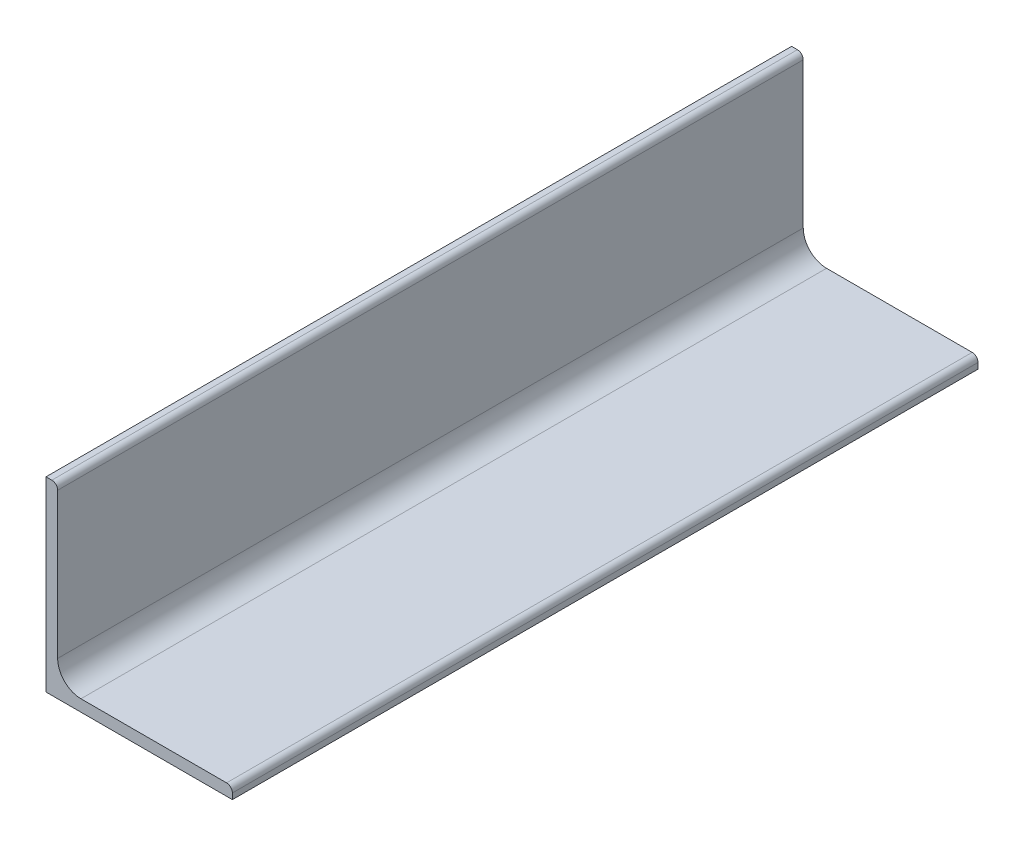
ISO-10303-21;
HEADER;
FILE_DESCRIPTION(('STEP AP214'),'2;1');
FILE_NAME('part.step','',(''),(''),'','','');
FILE_SCHEMA(('AUTOMOTIVE_DESIGN { 1 0 10303 214 1 1 1 1 }'));
ENDSEC;
DATA;
#1=APPLICATION_CONTEXT('core data for automotive mechanical design processes');
#2=APPLICATION_PROTOCOL_DEFINITION('international standard','automotive_design',2000,#1);
#3=PRODUCT_CONTEXT('',#1,'mechanical');
#4=PRODUCT('Part','Part','',(#3));
#5=PRODUCT_RELATED_PRODUCT_CATEGORY('part','',(#4));
#6=PRODUCT_DEFINITION_FORMATION('','',#4);
#7=PRODUCT_DEFINITION_CONTEXT('part definition',#1,'design');
#8=PRODUCT_DEFINITION('design','',#6,#7);
#9=PRODUCT_DEFINITION_SHAPE('','',#8);
#10=(LENGTH_UNIT() NAMED_UNIT(*) SI_UNIT(.MILLI.,.METRE.));
#11=(NAMED_UNIT(*) PLANE_ANGLE_UNIT() SI_UNIT($,.RADIAN.));
#12=(NAMED_UNIT(*) SI_UNIT($,.STERADIAN.) SOLID_ANGLE_UNIT());
#13=UNCERTAINTY_MEASURE_WITH_UNIT(LENGTH_MEASURE(1.E-05),#10,'distance_accuracy_value','');
#14=(GEOMETRIC_REPRESENTATION_CONTEXT(3) GLOBAL_UNCERTAINTY_ASSIGNED_CONTEXT((#13)) GLOBAL_UNIT_ASSIGNED_CONTEXT((#10,
#11,#12)) REPRESENTATION_CONTEXT('',''));
#15=CARTESIAN_POINT('',(0.,0.,0.));
#16=DIRECTION('',(0.,0.,1.));
#17=DIRECTION('',(1.,0.,0.));
#18=AXIS2_PLACEMENT_3D('',#15,#16,#17);
#19=CARTESIAN_POINT('',(0.490776827053332,76.2882459217981,304.8));
#20=DIRECTION('',(1.,0.,0.));
#21=DIRECTION('',(0.,0.,-1.));
#22=AXIS2_PLACEMENT_3D('',#19,#20,#21);
#23=PLANE('',#22);
#24=DIRECTION('',(0.,-1.,0.));
#25=VECTOR('',#24,1.);
#26=CARTESIAN_POINT('',(0.490776827053332,76.2882459217981,0.));
#27=LINE('',#26,#25);
#28=CARTESIAN_POINT('',(0.490776827053332,76.2882459217981,0.));
#29=VERTEX_POINT('',#28);
#30=CARTESIAN_POINT('',(0.490776827053332,0.0882459217980795,0.));
#31=VERTEX_POINT('',#30);
#32=EDGE_CURVE('E135',#29,#31,#27,.T.);
#33=ORIENTED_EDGE('',*,*,#32,.T.);
#34=DIRECTION('',(0.,0.,-1.));
#35=VECTOR('',#34,1.);
#36=CARTESIAN_POINT('',(0.490776827053332,0.0882459217980795,304.8));
#37=LINE('',#36,#35);
#38=CARTESIAN_POINT('',(0.490776827053332,0.0882459217980795,304.8));
#39=VERTEX_POINT('',#38);
#40=EDGE_CURVE('E11',#39,#31,#37,.T.);
#41=ORIENTED_EDGE('',*,*,#40,.F.);
#42=DIRECTION('',(0.,-1.,0.));
#43=VECTOR('',#42,1.);
#44=CARTESIAN_POINT('',(0.490776827053332,76.2882459217981,304.8));
#45=LINE('',#44,#43);
#46=CARTESIAN_POINT('',(0.490776827053332,76.2882459217981,304.8));
#47=VERTEX_POINT('',#46);
#48=EDGE_CURVE('E151',#47,#39,#45,.T.);
#49=ORIENTED_EDGE('',*,*,#48,.F.);
#50=DIRECTION('',(0.,0.,-1.));
#51=VECTOR('',#50,1.);
#52=CARTESIAN_POINT('',(0.490776827053332,76.2882459217981,304.8));
#53=LINE('',#52,#51);
#54=EDGE_CURVE('E131',#47,#29,#53,.T.);
#55=ORIENTED_EDGE('',*,*,#54,.T.);
#56=EDGE_LOOP('',(#33,#41,#49,#55));
#57=FACE_BOUND('',#56,.T.);
#58=ADVANCED_FACE('F33',(#57),#23,.F.);
#59=CARTESIAN_POINT('',(0.490776827053332,0.0882459217980795,304.8));
#60=DIRECTION('',(0.,1.,0.));
#61=DIRECTION('',(0.,0.,1.));
#62=AXIS2_PLACEMENT_3D('',#59,#60,#61);
#63=PLANE('',#62);
#64=DIRECTION('',(1.,0.,0.));
#65=VECTOR('',#64,1.);
#66=CARTESIAN_POINT('',(0.490776827053332,0.0882459217980795,0.));
#67=LINE('',#66,#65);
#68=CARTESIAN_POINT('',(76.6907768270533,0.0882459217980795,0.));
#69=VERTEX_POINT('',#68);
#70=EDGE_CURVE('E138',#31,#69,#67,.T.);
#71=ORIENTED_EDGE('',*,*,#70,.T.);
#72=DIRECTION('',(0.,0.,-1.));
#73=VECTOR('',#72,1.);
#74=CARTESIAN_POINT('',(76.6907768270533,0.0882459217980795,304.8));
#75=LINE('',#74,#73);
#76=CARTESIAN_POINT('',(76.6907768270533,0.0882459217980795,304.8));
#77=VERTEX_POINT('',#76);
#78=EDGE_CURVE('E41',#77,#69,#75,.T.);
#79=ORIENTED_EDGE('',*,*,#78,.F.);
#80=DIRECTION('',(1.,0.,0.));
#81=VECTOR('',#80,1.);
#82=CARTESIAN_POINT('',(0.490776827053332,0.0882459217980795,304.8));
#83=LINE('',#82,#81);
#84=EDGE_CURVE('E95',#39,#77,#83,.T.);
#85=ORIENTED_EDGE('',*,*,#84,.F.);
#86=ORIENTED_EDGE('',*,*,#40,.T.);
#87=EDGE_LOOP('',(#71,#79,#85,#86));
#88=FACE_BOUND('',#87,.T.);
#89=ADVANCED_FACE('F194',(#88),#63,.F.);
#90=CARTESIAN_POINT('',(76.6907768270533,0.0882459217980795,304.8));
#91=DIRECTION('',(-1.,0.,0.));
#92=DIRECTION('',(0.,0.,1.));
#93=AXIS2_PLACEMENT_3D('',#90,#91,#92);
#94=PLANE('',#93);
#95=DIRECTION('',(0.,1.,0.));
#96=VECTOR('',#95,1.);
#97=CARTESIAN_POINT('',(76.6907768270533,0.0882459217980795,0.));
#98=LINE('',#97,#96);
#99=CARTESIAN_POINT('',(76.6907768270533,2.46949592179808,0.));
#100=VERTEX_POINT('',#99);
#101=EDGE_CURVE('E140',#69,#100,#98,.T.);
#102=ORIENTED_EDGE('',*,*,#101,.T.);
#103=DIRECTION('',(0.,0.,-1.));
#104=VECTOR('',#103,1.);
#105=CARTESIAN_POINT('',(76.6907768270533,2.46949592179808,304.8));
#106=LINE('',#105,#104);
#107=CARTESIAN_POINT('',(76.6907768270533,2.46949592179808,304.8));
#108=VERTEX_POINT('',#107);
#109=EDGE_CURVE('E161',#108,#100,#106,.T.);
#110=ORIENTED_EDGE('',*,*,#109,.F.);
#111=DIRECTION('',(0.,1.,0.));
#112=VECTOR('',#111,1.);
#113=CARTESIAN_POINT('',(76.6907768270533,0.0882459217980795,304.8));
#114=LINE('',#113,#112);
#115=EDGE_CURVE('E169',#77,#108,#114,.T.);
#116=ORIENTED_EDGE('',*,*,#115,.F.);
#117=ORIENTED_EDGE('',*,*,#78,.T.);
#118=EDGE_LOOP('',(#102,#110,#116,#117));
#119=FACE_BOUND('',#118,.T.);
#120=ADVANCED_FACE('F167',(#119),#94,.F.);
#121=CARTESIAN_POINT('',(74.3095268270533,2.46949592179808,304.8));
#122=DIRECTION('',(0.,0.,-1.));
#123=DIRECTION('',(-1.,0.,0.));
#124=AXIS2_PLACEMENT_3D('',#121,#122,#123);
#125=CYLINDRICAL_SURFACE('',#124,2.38125);
#126=CARTESIAN_POINT('',(74.3095268270533,2.46949592179808,0.));
#127=DIRECTION('',(0.,0.,1.));
#128=DIRECTION('',(1.,0.,0.));
#129=AXIS2_PLACEMENT_3D('',#126,#127,#128);
#130=CIRCLE('',#129,2.38125);
#131=CARTESIAN_POINT('',(74.3095268270533,4.85074592179808,0.));
#132=VERTEX_POINT('',#131);
#133=EDGE_CURVE('E142',#100,#132,#130,.T.);
#134=ORIENTED_EDGE('',*,*,#133,.T.);
#135=DIRECTION('',(0.,0.,-1.));
#136=VECTOR('',#135,1.);
#137=CARTESIAN_POINT('',(74.3095268270533,4.85074592179808,304.8));
#138=LINE('',#137,#136);
#139=CARTESIAN_POINT('',(74.3095268270533,4.85074592179808,304.8));
#140=VERTEX_POINT('',#139);
#141=EDGE_CURVE('E158',#140,#132,#138,.T.);
#142=ORIENTED_EDGE('',*,*,#141,.F.);
#143=CARTESIAN_POINT('',(74.3095268270533,2.46949592179808,304.8));
#144=DIRECTION('',(0.,0.,1.));
#145=DIRECTION('',(1.,0.,0.));
#146=AXIS2_PLACEMENT_3D('',#143,#144,#145);
#147=CIRCLE('',#146,2.38125);
#148=EDGE_CURVE('E185',#108,#140,#147,.T.);
#149=ORIENTED_EDGE('',*,*,#148,.F.);
#150=ORIENTED_EDGE('',*,*,#109,.T.);
#151=EDGE_LOOP('',(#134,#142,#149,#150));
#152=FACE_BOUND('',#151,.T.);
#153=ADVANCED_FACE('F178',(#152),#125,.T.);
#154=CARTESIAN_POINT('',(74.3095268270533,4.85074592179808,304.8));
#155=DIRECTION('',(0.,-1.,0.));
#156=DIRECTION('',(0.,0.,-1.));
#157=AXIS2_PLACEMENT_3D('',#154,#155,#156);
#158=PLANE('',#157);
#159=DIRECTION('',(-1.,0.,0.));
#160=VECTOR('',#159,1.);
#161=CARTESIAN_POINT('',(74.3095268270533,4.85074592179808,0.));
#162=LINE('',#161,#160);
#163=CARTESIAN_POINT('',(14.7782768270533,4.85074592179808,0.));
#164=VERTEX_POINT('',#163);
#165=EDGE_CURVE('E144',#132,#164,#162,.T.);
#166=ORIENTED_EDGE('',*,*,#165,.T.);
#167=DIRECTION('',(0.,0.,-1.));
#168=VECTOR('',#167,1.);
#169=CARTESIAN_POINT('',(14.7782768270533,4.85074592179808,304.8));
#170=LINE('',#169,#168);
#171=CARTESIAN_POINT('',(14.7782768270533,4.85074592179808,304.8));
#172=VERTEX_POINT('',#171);
#173=EDGE_CURVE('E155',#172,#164,#170,.T.);
#174=ORIENTED_EDGE('',*,*,#173,.F.);
#175=DIRECTION('',(-1.,0.,0.));
#176=VECTOR('',#175,1.);
#177=CARTESIAN_POINT('',(74.3095268270533,4.85074592179808,304.8));
#178=LINE('',#177,#176);
#179=EDGE_CURVE('E184',#140,#172,#178,.T.);
#180=ORIENTED_EDGE('',*,*,#179,.F.);
#181=ORIENTED_EDGE('',*,*,#141,.T.);
#182=EDGE_LOOP('',(#166,#174,#180,#181));
#183=FACE_BOUND('',#182,.T.);
#184=ADVANCED_FACE('F182',(#183),#158,.F.);
#185=CARTESIAN_POINT('',(14.7782768270533,14.3757459217981,304.8));
#186=DIRECTION('',(0.,0.,-1.));
#187=DIRECTION('',(-1.,0.,0.));
#188=AXIS2_PLACEMENT_3D('',#185,#186,#187);
#189=CYLINDRICAL_SURFACE('',#188,9.52499999999998);
#190=CARTESIAN_POINT('',(14.7782768270533,14.3757459217981,0.));
#191=DIRECTION('',(0.,0.,-1.));
#192=DIRECTION('',(1.,0.,0.));
#193=AXIS2_PLACEMENT_3D('',#190,#191,#192);
#194=CIRCLE('',#193,9.52499999999998);
#195=CARTESIAN_POINT('',(5.25327682705333,14.3757459217981,0.));
#196=VERTEX_POINT('',#195);
#197=EDGE_CURVE('E146',#164,#196,#194,.T.);
#198=ORIENTED_EDGE('',*,*,#197,.T.);
#199=DIRECTION('',(0.,0.,-1.));
#200=VECTOR('',#199,1.);
#201=CARTESIAN_POINT('',(5.25327682705333,14.3757459217981,304.8));
#202=LINE('',#201,#200);
#203=CARTESIAN_POINT('',(5.25327682705333,14.3757459217981,304.8));
#204=VERTEX_POINT('',#203);
#205=EDGE_CURVE('E126',#204,#196,#202,.T.);
#206=ORIENTED_EDGE('',*,*,#205,.F.);
#207=CARTESIAN_POINT('',(14.7782768270533,14.3757459217981,304.8));
#208=DIRECTION('',(0.,0.,-1.));
#209=DIRECTION('',(1.,0.,0.));
#210=AXIS2_PLACEMENT_3D('',#207,#208,#209);
#211=CIRCLE('',#210,9.52499999999998);
#212=EDGE_CURVE('E117',#172,#204,#211,.T.);
#213=ORIENTED_EDGE('',*,*,#212,.F.);
#214=ORIENTED_EDGE('',*,*,#173,.T.);
#215=EDGE_LOOP('',(#198,#206,#213,#214));
#216=FACE_BOUND('',#215,.T.);
#217=ADVANCED_FACE('F206',(#216),#189,.F.);
#218=CARTESIAN_POINT('',(5.25327682705333,14.3757459217981,304.8));
#219=DIRECTION('',(-1.,0.,0.));
#220=DIRECTION('',(0.,0.,1.));
#221=AXIS2_PLACEMENT_3D('',#218,#219,#220);
#222=PLANE('',#221);
#223=DIRECTION('',(0.,1.,0.));
#224=VECTOR('',#223,1.);
#225=CARTESIAN_POINT('',(5.25327682705333,14.3757459217981,0.));
#226=LINE('',#225,#224);
#227=CARTESIAN_POINT('',(5.25327682705333,73.9069959217981,0.));
#228=VERTEX_POINT('',#227);
#229=EDGE_CURVE('E125',#196,#228,#226,.T.);
#230=ORIENTED_EDGE('',*,*,#229,.T.);
#231=DIRECTION('',(0.,0.,-1.));
#232=VECTOR('',#231,1.);
#233=CARTESIAN_POINT('',(5.25327682705333,73.9069959217981,304.8));
#234=LINE('',#233,#232);
#235=CARTESIAN_POINT('',(5.25327682705333,73.9069959217981,304.8));
#236=VERTEX_POINT('',#235);
#237=EDGE_CURVE('E122',#236,#228,#234,.T.);
#238=ORIENTED_EDGE('',*,*,#237,.F.);
#239=DIRECTION('',(0.,1.,0.));
#240=VECTOR('',#239,1.);
#241=CARTESIAN_POINT('',(5.25327682705333,14.3757459217981,304.8));
#242=LINE('',#241,#240);
#243=EDGE_CURVE('E111',#204,#236,#242,.T.);
#244=ORIENTED_EDGE('',*,*,#243,.F.);
#245=ORIENTED_EDGE('',*,*,#205,.T.);
#246=EDGE_LOOP('',(#230,#238,#244,#245));
#247=FACE_BOUND('',#246,.T.);
#248=ADVANCED_FACE('F123',(#247),#222,.F.);
#249=CARTESIAN_POINT('',(2.87202682705333,73.9069959217981,304.8));
#250=DIRECTION('',(0.,0.,-1.));
#251=DIRECTION('',(-1.,0.,0.));
#252=AXIS2_PLACEMENT_3D('',#249,#250,#251);
#253=CYLINDRICAL_SURFACE('',#252,2.38125);
#254=CARTESIAN_POINT('',(2.87202682705333,73.9069959217981,0.));
#255=DIRECTION('',(0.,0.,1.));
#256=DIRECTION('',(1.,0.,0.));
#257=AXIS2_PLACEMENT_3D('',#254,#255,#256);
#258=CIRCLE('',#257,2.38125);
#259=CARTESIAN_POINT('',(2.87202682705333,76.2882459217981,0.));
#260=VERTEX_POINT('',#259);
#261=EDGE_CURVE('E81',#228,#260,#258,.T.);
#262=ORIENTED_EDGE('',*,*,#261,.T.);
#263=DIRECTION('',(0.,0.,-1.));
#264=VECTOR('',#263,1.);
#265=CARTESIAN_POINT('',(2.87202682705333,76.2882459217981,304.8));
#266=LINE('',#265,#264);
#267=CARTESIAN_POINT('',(2.87202682705333,76.2882459217981,304.8));
#268=VERTEX_POINT('',#267);
#269=EDGE_CURVE('E127',#268,#260,#266,.T.);
#270=ORIENTED_EDGE('',*,*,#269,.F.);
#271=CARTESIAN_POINT('',(2.87202682705333,73.9069959217981,304.8));
#272=DIRECTION('',(0.,0.,1.));
#273=DIRECTION('',(1.,0.,0.));
#274=AXIS2_PLACEMENT_3D('',#271,#272,#273);
#275=CIRCLE('',#274,2.38125);
#276=EDGE_CURVE('E115',#236,#268,#275,.T.);
#277=ORIENTED_EDGE('',*,*,#276,.F.);
#278=ORIENTED_EDGE('',*,*,#237,.T.);
#279=EDGE_LOOP('',(#262,#270,#277,#278));
#280=FACE_BOUND('',#279,.T.);
#281=ADVANCED_FACE('F129',(#280),#253,.T.);
#282=CARTESIAN_POINT('',(2.87202682705333,76.2882459217981,304.8));
#283=DIRECTION('',(0.,-1.,0.));
#284=DIRECTION('',(0.,0.,-1.));
#285=AXIS2_PLACEMENT_3D('',#282,#283,#284);
#286=PLANE('',#285);
#287=DIRECTION('',(-1.,0.,0.));
#288=VECTOR('',#287,1.);
#289=CARTESIAN_POINT('',(2.87202682705333,76.2882459217981,0.));
#290=LINE('',#289,#288);
#291=EDGE_CURVE('E87',#260,#29,#290,.T.);
#292=ORIENTED_EDGE('',*,*,#291,.T.);
#293=ORIENTED_EDGE('',*,*,#54,.F.);
#294=DIRECTION('',(-1.,0.,0.));
#295=VECTOR('',#294,1.);
#296=CARTESIAN_POINT('',(2.87202682705333,76.2882459217981,304.8));
#297=LINE('',#296,#295);
#298=EDGE_CURVE('E49',#268,#47,#297,.T.);
#299=ORIENTED_EDGE('',*,*,#298,.F.);
#300=ORIENTED_EDGE('',*,*,#269,.T.);
#301=EDGE_LOOP('',(#292,#293,#299,#300));
#302=FACE_BOUND('',#301,.T.);
#303=ADVANCED_FACE('F214',(#302),#286,.F.);
#304=CARTESIAN_POINT('',(74.3095268270533,2.46949592179808,304.8));
#305=DIRECTION('',(0.,0.,1.));
#306=DIRECTION('',(1.,0.,0.));
#307=AXIS2_PLACEMENT_3D('',#304,#305,#306);
#308=PLANE('',#307);
#309=ORIENTED_EDGE('',*,*,#48,.T.);
#310=ORIENTED_EDGE('',*,*,#84,.T.);
#311=ORIENTED_EDGE('',*,*,#115,.T.);
#312=ORIENTED_EDGE('',*,*,#148,.T.);
#313=ORIENTED_EDGE('',*,*,#179,.T.);
#314=ORIENTED_EDGE('',*,*,#212,.T.);
#315=ORIENTED_EDGE('',*,*,#243,.T.);
#316=ORIENTED_EDGE('',*,*,#276,.T.);
#317=ORIENTED_EDGE('',*,*,#298,.T.);
#318=EDGE_LOOP('',(#309,#310,#311,#312,#313,#314,#315,#316,#317));
#319=FACE_BOUND('',#318,.T.);
#320=ADVANCED_FACE('F113',(#319),#308,.T.);
#321=CARTESIAN_POINT('',(74.3095268270533,2.46949592179808,0.));
#322=DIRECTION('',(0.,0.,1.));
#323=DIRECTION('',(1.,0.,0.));
#324=AXIS2_PLACEMENT_3D('',#321,#322,#323);
#325=PLANE('',#324);
#326=ORIENTED_EDGE('',*,*,#32,.F.);
#327=ORIENTED_EDGE('',*,*,#291,.F.);
#328=ORIENTED_EDGE('',*,*,#261,.F.);
#329=ORIENTED_EDGE('',*,*,#229,.F.);
#330=ORIENTED_EDGE('',*,*,#197,.F.);
#331=ORIENTED_EDGE('',*,*,#165,.F.);
#332=ORIENTED_EDGE('',*,*,#133,.F.);
#333=ORIENTED_EDGE('',*,*,#101,.F.);
#334=ORIENTED_EDGE('',*,*,#70,.F.);
#335=EDGE_LOOP('',(#326,#327,#328,#329,#330,#331,#332,#333,#334));
#336=FACE_BOUND('',#335,.T.);
#337=ADVANCED_FACE('F173',(#336),#325,.F.);
#338=CLOSED_SHELL('',(#58,#89,#120,#153,#184,#217,#248,#281,#303,#320,#337));
#339=MANIFOLD_SOLID_BREP('B2',#338);
#340=ADVANCED_BREP_SHAPE_REPRESENTATION('',(#18,#339),#14);
#341=SHAPE_DEFINITION_REPRESENTATION(#9,#340);
ENDSEC;
END-ISO-10303-21;
